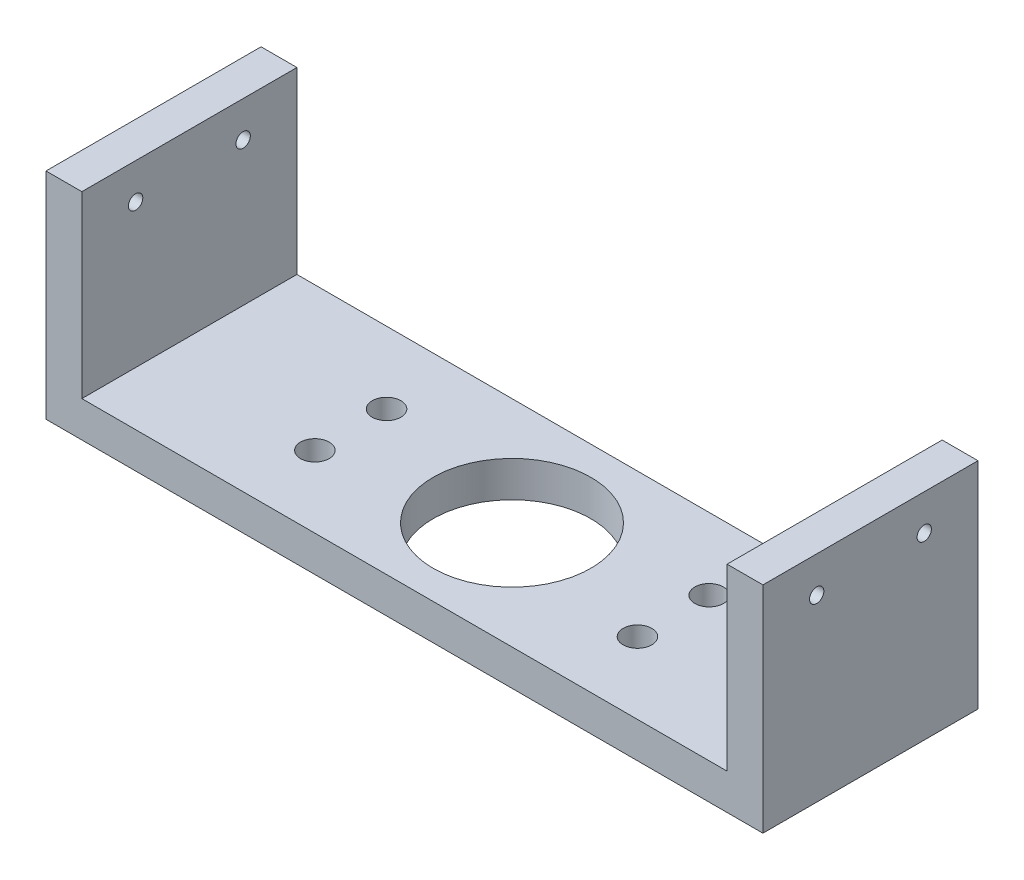
ISO-10303-21;
HEADER;
FILE_DESCRIPTION(('STEP AP214'),'2;1');
FILE_NAME('part.step','',(''),(''),'','','');
FILE_SCHEMA(('AUTOMOTIVE_DESIGN { 1 0 10303 214 1 1 1 1 }'));
ENDSEC;
DATA;
#1=APPLICATION_CONTEXT('core data for automotive mechanical design processes');
#2=APPLICATION_PROTOCOL_DEFINITION('international standard','automotive_design',2000,#1);
#3=PRODUCT_CONTEXT('',#1,'mechanical');
#4=PRODUCT('Part','Part','',(#3));
#5=PRODUCT_RELATED_PRODUCT_CATEGORY('part','',(#4));
#6=PRODUCT_DEFINITION_FORMATION('','',#4);
#7=PRODUCT_DEFINITION_CONTEXT('part definition',#1,'design');
#8=PRODUCT_DEFINITION('design','',#6,#7);
#9=PRODUCT_DEFINITION_SHAPE('','',#8);
#10=(LENGTH_UNIT() NAMED_UNIT(*) SI_UNIT(.MILLI.,.METRE.));
#11=(NAMED_UNIT(*) PLANE_ANGLE_UNIT() SI_UNIT($,.RADIAN.));
#12=(NAMED_UNIT(*) SI_UNIT($,.STERADIAN.) SOLID_ANGLE_UNIT());
#13=UNCERTAINTY_MEASURE_WITH_UNIT(LENGTH_MEASURE(1.E-05),#10,'distance_accuracy_value','');
#14=(GEOMETRIC_REPRESENTATION_CONTEXT(3) GLOBAL_UNCERTAINTY_ASSIGNED_CONTEXT((#13)) GLOBAL_UNIT_ASSIGNED_CONTEXT((#10,
#11,#12)) REPRESENTATION_CONTEXT('',''));
#15=CARTESIAN_POINT('',(0.,0.,0.));
#16=DIRECTION('',(0.,0.,1.));
#17=DIRECTION('',(1.,0.,0.));
#18=AXIS2_PLACEMENT_3D('',#15,#16,#17);
#19=CARTESIAN_POINT('',(0.,5.,0.));
#20=DIRECTION('',(0.,1.,0.));
#21=DIRECTION('',(0.,0.,1.));
#22=AXIS2_PLACEMENT_3D('',#19,#20,#21);
#23=PLANE('',#22);
#24=CARTESIAN_POINT('',(22.5,5.,-4.99999999999999));
#25=DIRECTION('',(0.,1.,0.));
#26=DIRECTION('',(0.,0.,1.));
#27=AXIS2_PLACEMENT_3D('',#24,#25,#26);
#28=CIRCLE('',#27,2.);
#29=CARTESIAN_POINT('',(22.5,5.,-2.99999999999999));
#30=VERTEX_POINT('',#29);
#31=EDGE_CURVE('E188',#30,#30,#28,.T.);
#32=ORIENTED_EDGE('',*,*,#31,.F.);
#33=EDGE_LOOP('',(#32));
#34=FACE_BOUND('',#33,.T.);
#35=CARTESIAN_POINT('',(-22.5,5.,5.));
#36=DIRECTION('',(0.,1.,0.));
#37=DIRECTION('',(0.,0.,1.));
#38=AXIS2_PLACEMENT_3D('',#35,#36,#37);
#39=CIRCLE('',#38,2.);
#40=CARTESIAN_POINT('',(-22.5,5.,7.));
#41=VERTEX_POINT('',#40);
#42=EDGE_CURVE('E328',#41,#41,#39,.T.);
#43=ORIENTED_EDGE('',*,*,#42,.F.);
#44=EDGE_LOOP('',(#43));
#45=FACE_BOUND('',#44,.T.);
#46=CARTESIAN_POINT('',(22.5,5.,5.00000000000001));
#47=DIRECTION('',(0.,1.,0.));
#48=DIRECTION('',(0.,0.,1.));
#49=AXIS2_PLACEMENT_3D('',#46,#47,#48);
#50=CIRCLE('',#49,2.);
#51=CARTESIAN_POINT('',(22.5,5.,7.00000000000001));
#52=VERTEX_POINT('',#51);
#53=EDGE_CURVE('E309',#52,#52,#50,.T.);
#54=ORIENTED_EDGE('',*,*,#53,.F.);
#55=EDGE_LOOP('',(#54));
#56=FACE_BOUND('',#55,.T.);
#57=CARTESIAN_POINT('',(-22.5,5.,-4.99999999999999));
#58=DIRECTION('',(0.,1.,0.));
#59=DIRECTION('',(0.,0.,1.));
#60=AXIS2_PLACEMENT_3D('',#57,#58,#59);
#61=CIRCLE('',#60,2.);
#62=CARTESIAN_POINT('',(-22.5,5.,-2.99999999999999));
#63=VERTEX_POINT('',#62);
#64=EDGE_CURVE('E325',#63,#63,#61,.T.);
#65=ORIENTED_EDGE('',*,*,#64,.F.);
#66=EDGE_LOOP('',(#65));
#67=FACE_BOUND('',#66,.T.);
#68=CARTESIAN_POINT('',(0.,5.,0.));
#69=DIRECTION('',(0.,1.,0.));
#70=DIRECTION('',(0.,0.,1.));
#71=AXIS2_PLACEMENT_3D('',#68,#69,#70);
#72=CIRCLE('',#71,11.);
#73=CARTESIAN_POINT('',(0.,5.,11.));
#74=VERTEX_POINT('',#73);
#75=EDGE_CURVE('E154',#74,#74,#72,.T.);
#76=ORIENTED_EDGE('',*,*,#75,.F.);
#77=EDGE_LOOP('',(#76));
#78=FACE_BOUND('',#77,.T.);
#79=DIRECTION('',(1.,0.,0.));
#80=VECTOR('',#79,1.);
#81=CARTESIAN_POINT('',(-50.,5.,15.));
#82=LINE('',#81,#80);
#83=CARTESIAN_POINT('',(-45.,5.,15.));
#84=VERTEX_POINT('',#83);
#85=CARTESIAN_POINT('',(45.,5.,15.));
#86=VERTEX_POINT('',#85);
#87=EDGE_CURVE('E61',#84,#86,#82,.T.);
#88=ORIENTED_EDGE('',*,*,#87,.T.);
#89=DIRECTION('',(0.,0.,1.));
#90=VECTOR('',#89,1.);
#91=CARTESIAN_POINT('',(45.,5.,-15.));
#92=LINE('',#91,#90);
#93=CARTESIAN_POINT('',(45.,5.,-15.));
#94=VERTEX_POINT('',#93);
#95=EDGE_CURVE('E56',#94,#86,#92,.T.);
#96=ORIENTED_EDGE('',*,*,#95,.F.);
#97=DIRECTION('',(-1.,0.,0.));
#98=VECTOR('',#97,1.);
#99=CARTESIAN_POINT('',(-50.,5.,-15.));
#100=LINE('',#99,#98);
#101=CARTESIAN_POINT('',(-45.,5.,-15.));
#102=VERTEX_POINT('',#101);
#103=EDGE_CURVE('E160',#94,#102,#100,.T.);
#104=ORIENTED_EDGE('',*,*,#103,.T.);
#105=DIRECTION('',(0.,0.,-1.));
#106=VECTOR('',#105,1.);
#107=CARTESIAN_POINT('',(-45.,5.,-15.));
#108=LINE('',#107,#106);
#109=EDGE_CURVE('E130',#84,#102,#108,.T.);
#110=ORIENTED_EDGE('',*,*,#109,.F.);
#111=EDGE_LOOP('',(#88,#96,#104,#110));
#112=FACE_BOUND('',#111,.T.);
#113=ADVANCED_FACE('F39',(#34,#45,#56,#67,#78,#112),#23,.T.);
#114=CARTESIAN_POINT('',(0.,0.,0.));
#115=DIRECTION('',(0.,1.,0.));
#116=DIRECTION('',(0.,0.,1.));
#117=AXIS2_PLACEMENT_3D('',#114,#115,#116);
#118=PLANE('',#117);
#119=CARTESIAN_POINT('',(22.5,0.,-4.99999999999999));
#120=DIRECTION('',(0.,-1.,0.));
#121=DIRECTION('',(0.,0.,-1.));
#122=AXIS2_PLACEMENT_3D('',#119,#120,#121);
#123=CIRCLE('',#122,2.);
#124=CARTESIAN_POINT('',(22.5,0.,-6.99999999999999));
#125=VERTEX_POINT('',#124);
#126=EDGE_CURVE('E317',#125,#125,#123,.T.);
#127=ORIENTED_EDGE('',*,*,#126,.F.);
#128=EDGE_LOOP('',(#127));
#129=FACE_BOUND('',#128,.T.);
#130=CARTESIAN_POINT('',(-22.5,0.,5.));
#131=DIRECTION('',(0.,-1.,0.));
#132=DIRECTION('',(0.,0.,-1.));
#133=AXIS2_PLACEMENT_3D('',#130,#131,#132);
#134=CIRCLE('',#133,2.);
#135=CARTESIAN_POINT('',(-22.5,0.,3.));
#136=VERTEX_POINT('',#135);
#137=EDGE_CURVE('E314',#136,#136,#134,.T.);
#138=ORIENTED_EDGE('',*,*,#137,.F.);
#139=EDGE_LOOP('',(#138));
#140=FACE_BOUND('',#139,.T.);
#141=CARTESIAN_POINT('',(22.5,0.,5.00000000000001));
#142=DIRECTION('',(0.,-1.,0.));
#143=DIRECTION('',(0.,0.,-1.));
#144=AXIS2_PLACEMENT_3D('',#141,#142,#143);
#145=CIRCLE('',#144,2.);
#146=CARTESIAN_POINT('',(22.5,0.,3.));
#147=VERTEX_POINT('',#146);
#148=EDGE_CURVE('E312',#147,#147,#145,.T.);
#149=ORIENTED_EDGE('',*,*,#148,.F.);
#150=EDGE_LOOP('',(#149));
#151=FACE_BOUND('',#150,.T.);
#152=CARTESIAN_POINT('',(-22.5,0.,-4.99999999999999));
#153=DIRECTION('',(0.,-1.,0.));
#154=DIRECTION('',(0.,0.,-1.));
#155=AXIS2_PLACEMENT_3D('',#152,#153,#154);
#156=CIRCLE('',#155,2.);
#157=CARTESIAN_POINT('',(-22.5,0.,-7.));
#158=VERTEX_POINT('',#157);
#159=EDGE_CURVE('E321',#158,#158,#156,.T.);
#160=ORIENTED_EDGE('',*,*,#159,.F.);
#161=EDGE_LOOP('',(#160));
#162=FACE_BOUND('',#161,.T.);
#163=DIRECTION('',(0.,0.,-1.));
#164=VECTOR('',#163,1.);
#165=CARTESIAN_POINT('',(50.,0.,-15.));
#166=LINE('',#165,#164);
#167=CARTESIAN_POINT('',(50.,0.,15.));
#168=VERTEX_POINT('',#167);
#169=CARTESIAN_POINT('',(50.,0.,-15.));
#170=VERTEX_POINT('',#169);
#171=EDGE_CURVE('E157',#168,#170,#166,.T.);
#172=ORIENTED_EDGE('',*,*,#171,.F.);
#173=DIRECTION('',(1.,0.,0.));
#174=VECTOR('',#173,1.);
#175=CARTESIAN_POINT('',(-50.,0.,15.));
#176=LINE('',#175,#174);
#177=CARTESIAN_POINT('',(-50.,0.,15.));
#178=VERTEX_POINT('',#177);
#179=EDGE_CURVE('E111',#178,#168,#176,.T.);
#180=ORIENTED_EDGE('',*,*,#179,.F.);
#181=DIRECTION('',(0.,0.,1.));
#182=VECTOR('',#181,1.);
#183=CARTESIAN_POINT('',(-50.,0.,-15.));
#184=LINE('',#183,#182);
#185=CARTESIAN_POINT('',(-50.,0.,-15.));
#186=VERTEX_POINT('',#185);
#187=EDGE_CURVE('E166',#186,#178,#184,.T.);
#188=ORIENTED_EDGE('',*,*,#187,.F.);
#189=DIRECTION('',(-1.,0.,0.));
#190=VECTOR('',#189,1.);
#191=CARTESIAN_POINT('',(-50.,0.,-15.));
#192=LINE('',#191,#190);
#193=EDGE_CURVE('E164',#170,#186,#192,.T.);
#194=ORIENTED_EDGE('',*,*,#193,.F.);
#195=EDGE_LOOP('',(#172,#180,#188,#194));
#196=FACE_BOUND('',#195,.T.);
#197=CARTESIAN_POINT('',(0.,0.,0.));
#198=DIRECTION('',(0.,1.,0.));
#199=DIRECTION('',(0.,0.,1.));
#200=AXIS2_PLACEMENT_3D('',#197,#198,#199);
#201=CIRCLE('',#200,11.);
#202=CARTESIAN_POINT('',(0.,0.,11.));
#203=VERTEX_POINT('',#202);
#204=EDGE_CURVE('E153',#203,#203,#201,.T.);
#205=ORIENTED_EDGE('',*,*,#204,.T.);
#206=EDGE_LOOP('',(#205));
#207=FACE_BOUND('',#206,.T.);
#208=ADVANCED_FACE('F221',(#129,#140,#151,#162,#196,#207),#118,.F.);
#209=CARTESIAN_POINT('',(50.,5.,-15.));
#210=DIRECTION('',(-1.,0.,0.));
#211=DIRECTION('',(0.,0.,1.));
#212=AXIS2_PLACEMENT_3D('',#209,#210,#211);
#213=PLANE('',#212);
#214=CARTESIAN_POINT('',(50.,25.,7.5));
#215=DIRECTION('',(1.,0.,0.));
#216=DIRECTION('',(0.,0.,-1.));
#217=AXIS2_PLACEMENT_3D('',#214,#215,#216);
#218=CIRCLE('',#217,1.);
#219=CARTESIAN_POINT('',(50.,25.,6.5));
#220=VERTEX_POINT('',#219);
#221=EDGE_CURVE('E180',#220,#220,#218,.T.);
#222=ORIENTED_EDGE('',*,*,#221,.F.);
#223=EDGE_LOOP('',(#222));
#224=FACE_BOUND('',#223,.T.);
#225=CARTESIAN_POINT('',(50.,25.,-7.5));
#226=DIRECTION('',(1.,0.,0.));
#227=DIRECTION('',(0.,0.,-1.));
#228=AXIS2_PLACEMENT_3D('',#225,#226,#227);
#229=CIRCLE('',#228,1.);
#230=CARTESIAN_POINT('',(50.,25.,-8.5));
#231=VERTEX_POINT('',#230);
#232=EDGE_CURVE('E185',#231,#231,#229,.T.);
#233=ORIENTED_EDGE('',*,*,#232,.F.);
#234=EDGE_LOOP('',(#233));
#235=FACE_BOUND('',#234,.T.);
#236=ORIENTED_EDGE('',*,*,#171,.T.);
#237=DIRECTION('',(0.,-1.,0.));
#238=VECTOR('',#237,1.);
#239=CARTESIAN_POINT('',(50.,5.,-15.));
#240=LINE('',#239,#238);
#241=CARTESIAN_POINT('',(50.,30.,-15.));
#242=VERTEX_POINT('',#241);
#243=EDGE_CURVE('E11',#242,#170,#240,.T.);
#244=ORIENTED_EDGE('',*,*,#243,.F.);
#245=DIRECTION('',(0.,0.,-1.));
#246=VECTOR('',#245,1.);
#247=CARTESIAN_POINT('',(50.,30.,-15.));
#248=LINE('',#247,#246);
#249=CARTESIAN_POINT('',(50.,30.,15.));
#250=VERTEX_POINT('',#249);
#251=EDGE_CURVE('E121',#250,#242,#248,.T.);
#252=ORIENTED_EDGE('',*,*,#251,.F.);
#253=DIRECTION('',(0.,-1.,0.));
#254=VECTOR('',#253,1.);
#255=CARTESIAN_POINT('',(50.,5.,15.));
#256=LINE('',#255,#254);
#257=EDGE_CURVE('E104',#250,#168,#256,.T.);
#258=ORIENTED_EDGE('',*,*,#257,.T.);
#259=EDGE_LOOP('',(#236,#244,#252,#258));
#260=FACE_BOUND('',#259,.T.);
#261=ADVANCED_FACE('F41',(#224,#235,#260),#213,.F.);
#262=CARTESIAN_POINT('',(-50.,5.,-15.));
#263=DIRECTION('',(0.,0.,1.));
#264=DIRECTION('',(1.,0.,0.));
#265=AXIS2_PLACEMENT_3D('',#262,#263,#264);
#266=PLANE('',#265);
#267=ORIENTED_EDGE('',*,*,#193,.T.);
#268=DIRECTION('',(0.,-1.,0.));
#269=VECTOR('',#268,1.);
#270=CARTESIAN_POINT('',(-50.,5.,-15.));
#271=LINE('',#270,#269);
#272=CARTESIAN_POINT('',(-50.,30.,-15.));
#273=VERTEX_POINT('',#272);
#274=EDGE_CURVE('E48',#273,#186,#271,.T.);
#275=ORIENTED_EDGE('',*,*,#274,.F.);
#276=DIRECTION('',(-1.,0.,0.));
#277=VECTOR('',#276,1.);
#278=CARTESIAN_POINT('',(-50.,30.,-15.));
#279=LINE('',#278,#277);
#280=CARTESIAN_POINT('',(-45.,30.,-15.));
#281=VERTEX_POINT('',#280);
#282=EDGE_CURVE('E142',#281,#273,#279,.T.);
#283=ORIENTED_EDGE('',*,*,#282,.F.);
#284=DIRECTION('',(0.,-1.,0.));
#285=VECTOR('',#284,1.);
#286=CARTESIAN_POINT('',(-45.,30.,-15.));
#287=LINE('',#286,#285);
#288=EDGE_CURVE('E145',#281,#102,#287,.T.);
#289=ORIENTED_EDGE('',*,*,#288,.T.);
#290=ORIENTED_EDGE('',*,*,#103,.F.);
#291=DIRECTION('',(0.,-1.,0.));
#292=VECTOR('',#291,1.);
#293=CARTESIAN_POINT('',(45.,30.,-15.));
#294=LINE('',#293,#292);
#295=CARTESIAN_POINT('',(45.,30.,-15.));
#296=VERTEX_POINT('',#295);
#297=EDGE_CURVE('E199',#296,#94,#294,.T.);
#298=ORIENTED_EDGE('',*,*,#297,.F.);
#299=DIRECTION('',(-1.,0.,0.));
#300=VECTOR('',#299,1.);
#301=CARTESIAN_POINT('',(50.,30.,-15.));
#302=LINE('',#301,#300);
#303=EDGE_CURVE('E128',#242,#296,#302,.T.);
#304=ORIENTED_EDGE('',*,*,#303,.F.);
#305=ORIENTED_EDGE('',*,*,#243,.T.);
#306=EDGE_LOOP('',(#267,#275,#283,#289,#290,#298,#304,#305));
#307=FACE_BOUND('',#306,.T.);
#308=ADVANCED_FACE('F207',(#307),#266,.F.);
#309=CARTESIAN_POINT('',(-50.,5.,-15.));
#310=DIRECTION('',(1.,0.,0.));
#311=DIRECTION('',(0.,0.,-1.));
#312=AXIS2_PLACEMENT_3D('',#309,#310,#311);
#313=PLANE('',#312);
#314=CARTESIAN_POINT('',(-50.,25.,7.5));
#315=DIRECTION('',(1.,0.,0.));
#316=DIRECTION('',(0.,0.,-1.));
#317=AXIS2_PLACEMENT_3D('',#314,#315,#316);
#318=CIRCLE('',#317,1.);
#319=CARTESIAN_POINT('',(-50.,25.,6.5));
#320=VERTEX_POINT('',#319);
#321=EDGE_CURVE('E174',#320,#320,#318,.T.);
#322=ORIENTED_EDGE('',*,*,#321,.T.);
#323=EDGE_LOOP('',(#322));
#324=FACE_BOUND('',#323,.T.);
#325=CARTESIAN_POINT('',(-50.,25.,-7.5));
#326=DIRECTION('',(1.,0.,0.));
#327=DIRECTION('',(0.,0.,-1.));
#328=AXIS2_PLACEMENT_3D('',#325,#326,#327);
#329=CIRCLE('',#328,1.);
#330=CARTESIAN_POINT('',(-50.,25.,-8.5));
#331=VERTEX_POINT('',#330);
#332=EDGE_CURVE('E193',#331,#331,#329,.T.);
#333=ORIENTED_EDGE('',*,*,#332,.T.);
#334=EDGE_LOOP('',(#333));
#335=FACE_BOUND('',#334,.T.);
#336=ORIENTED_EDGE('',*,*,#187,.T.);
#337=DIRECTION('',(0.,-1.,0.));
#338=VECTOR('',#337,1.);
#339=CARTESIAN_POINT('',(-50.,5.,15.));
#340=LINE('',#339,#338);
#341=CARTESIAN_POINT('',(-50.,30.,15.));
#342=VERTEX_POINT('',#341);
#343=EDGE_CURVE('E116',#342,#178,#340,.T.);
#344=ORIENTED_EDGE('',*,*,#343,.F.);
#345=DIRECTION('',(0.,0.,1.));
#346=VECTOR('',#345,1.);
#347=CARTESIAN_POINT('',(-50.,30.,-15.));
#348=LINE('',#347,#346);
#349=EDGE_CURVE('E135',#273,#342,#348,.T.);
#350=ORIENTED_EDGE('',*,*,#349,.F.);
#351=ORIENTED_EDGE('',*,*,#274,.T.);
#352=EDGE_LOOP('',(#336,#344,#350,#351));
#353=FACE_BOUND('',#352,.T.);
#354=ADVANCED_FACE('F218',(#324,#335,#353),#313,.F.);
#355=CARTESIAN_POINT('',(-50.,5.,15.));
#356=DIRECTION('',(0.,0.,-1.));
#357=DIRECTION('',(-1.,0.,0.));
#358=AXIS2_PLACEMENT_3D('',#355,#356,#357);
#359=PLANE('',#358);
#360=ORIENTED_EDGE('',*,*,#179,.T.);
#361=ORIENTED_EDGE('',*,*,#257,.F.);
#362=DIRECTION('',(1.,0.,0.));
#363=VECTOR('',#362,1.);
#364=CARTESIAN_POINT('',(50.,30.,15.));
#365=LINE('',#364,#363);
#366=CARTESIAN_POINT('',(45.,30.,15.));
#367=VERTEX_POINT('',#366);
#368=EDGE_CURVE('E108',#367,#250,#365,.T.);
#369=ORIENTED_EDGE('',*,*,#368,.F.);
#370=DIRECTION('',(0.,-1.,0.));
#371=VECTOR('',#370,1.);
#372=CARTESIAN_POINT('',(45.,30.,15.));
#373=LINE('',#372,#371);
#374=EDGE_CURVE('E125',#367,#86,#373,.T.);
#375=ORIENTED_EDGE('',*,*,#374,.T.);
#376=ORIENTED_EDGE('',*,*,#87,.F.);
#377=DIRECTION('',(0.,-1.,0.));
#378=VECTOR('',#377,1.);
#379=CARTESIAN_POINT('',(-45.,30.,15.));
#380=LINE('',#379,#378);
#381=CARTESIAN_POINT('',(-45.,30.,15.));
#382=VERTEX_POINT('',#381);
#383=EDGE_CURVE('E150',#382,#84,#380,.T.);
#384=ORIENTED_EDGE('',*,*,#383,.F.);
#385=DIRECTION('',(1.,0.,0.));
#386=VECTOR('',#385,1.);
#387=CARTESIAN_POINT('',(-50.,30.,15.));
#388=LINE('',#387,#386);
#389=EDGE_CURVE('E138',#342,#382,#388,.T.);
#390=ORIENTED_EDGE('',*,*,#389,.F.);
#391=ORIENTED_EDGE('',*,*,#343,.T.);
#392=EDGE_LOOP('',(#360,#361,#369,#375,#376,#384,#390,#391));
#393=FACE_BOUND('',#392,.T.);
#394=ADVANCED_FACE('F106',(#393),#359,.F.);
#395=CARTESIAN_POINT('',(0.,5.,0.));
#396=DIRECTION('',(0.,-1.,0.));
#397=DIRECTION('',(0.,0.,-1.));
#398=AXIS2_PLACEMENT_3D('',#395,#396,#397);
#399=CYLINDRICAL_SURFACE('',#398,11.);
#400=ORIENTED_EDGE('',*,*,#75,.T.);
#401=EDGE_LOOP('',(#400));
#402=FACE_BOUND('',#401,.T.);
#403=ORIENTED_EDGE('',*,*,#204,.F.);
#404=EDGE_LOOP('',(#403));
#405=FACE_BOUND('',#404,.T.);
#406=ADVANCED_FACE('F228',(#402,#405),#399,.F.);
#407=CARTESIAN_POINT('',(-45.,30.,-15.));
#408=DIRECTION('',(-1.,0.,0.));
#409=DIRECTION('',(0.,0.,1.));
#410=AXIS2_PLACEMENT_3D('',#407,#408,#409);
#411=PLANE('',#410);
#412=CARTESIAN_POINT('',(-45.,25.,7.5));
#413=DIRECTION('',(-1.,0.,0.));
#414=DIRECTION('',(0.,0.,1.));
#415=AXIS2_PLACEMENT_3D('',#412,#413,#414);
#416=CIRCLE('',#415,1.);
#417=CARTESIAN_POINT('',(-45.,25.,8.5));
#418=VERTEX_POINT('',#417);
#419=EDGE_CURVE('E196',#418,#418,#416,.T.);
#420=ORIENTED_EDGE('',*,*,#419,.T.);
#421=EDGE_LOOP('',(#420));
#422=FACE_BOUND('',#421,.T.);
#423=CARTESIAN_POINT('',(-45.,25.,-7.5));
#424=DIRECTION('',(-1.,0.,0.));
#425=DIRECTION('',(0.,0.,1.));
#426=AXIS2_PLACEMENT_3D('',#423,#424,#425);
#427=CIRCLE('',#426,1.);
#428=CARTESIAN_POINT('',(-45.,25.,-6.5));
#429=VERTEX_POINT('',#428);
#430=EDGE_CURVE('E173',#429,#429,#427,.T.);
#431=ORIENTED_EDGE('',*,*,#430,.T.);
#432=EDGE_LOOP('',(#431));
#433=FACE_BOUND('',#432,.T.);
#434=ORIENTED_EDGE('',*,*,#109,.T.);
#435=ORIENTED_EDGE('',*,*,#288,.F.);
#436=DIRECTION('',(0.,0.,-1.));
#437=VECTOR('',#436,1.);
#438=CARTESIAN_POINT('',(-45.,30.,-15.));
#439=LINE('',#438,#437);
#440=EDGE_CURVE('E140',#382,#281,#439,.T.);
#441=ORIENTED_EDGE('',*,*,#440,.F.);
#442=ORIENTED_EDGE('',*,*,#383,.T.);
#443=EDGE_LOOP('',(#434,#435,#441,#442));
#444=FACE_BOUND('',#443,.T.);
#445=ADVANCED_FACE('F211',(#422,#433,#444),#411,.F.);
#446=CARTESIAN_POINT('',(0.,30.,0.));
#447=DIRECTION('',(0.,1.,0.));
#448=DIRECTION('',(0.,0.,1.));
#449=AXIS2_PLACEMENT_3D('',#446,#447,#448);
#450=PLANE('',#449);
#451=ORIENTED_EDGE('',*,*,#349,.T.);
#452=ORIENTED_EDGE('',*,*,#389,.T.);
#453=ORIENTED_EDGE('',*,*,#440,.T.);
#454=ORIENTED_EDGE('',*,*,#282,.T.);
#455=EDGE_LOOP('',(#451,#452,#453,#454));
#456=FACE_BOUND('',#455,.T.);
#457=ADVANCED_FACE('F216',(#456),#450,.T.);
#458=CARTESIAN_POINT('',(45.,30.,-15.));
#459=DIRECTION('',(1.,0.,0.));
#460=DIRECTION('',(0.,0.,-1.));
#461=AXIS2_PLACEMENT_3D('',#458,#459,#460);
#462=PLANE('',#461);
#463=CARTESIAN_POINT('',(45.,25.,7.5));
#464=DIRECTION('',(1.,0.,0.));
#465=DIRECTION('',(0.,0.,-1.));
#466=AXIS2_PLACEMENT_3D('',#463,#464,#465);
#467=CIRCLE('',#466,1.);
#468=CARTESIAN_POINT('',(45.,25.,6.5));
#469=VERTEX_POINT('',#468);
#470=EDGE_CURVE('E43',#469,#469,#467,.T.);
#471=ORIENTED_EDGE('',*,*,#470,.T.);
#472=EDGE_LOOP('',(#471));
#473=FACE_BOUND('',#472,.T.);
#474=CARTESIAN_POINT('',(45.,25.,-7.5));
#475=DIRECTION('',(1.,0.,0.));
#476=DIRECTION('',(0.,0.,-1.));
#477=AXIS2_PLACEMENT_3D('',#474,#475,#476);
#478=CIRCLE('',#477,1.);
#479=CARTESIAN_POINT('',(45.,25.,-8.5));
#480=VERTEX_POINT('',#479);
#481=EDGE_CURVE('E171',#480,#480,#478,.T.);
#482=ORIENTED_EDGE('',*,*,#481,.T.);
#483=EDGE_LOOP('',(#482));
#484=FACE_BOUND('',#483,.T.);
#485=ORIENTED_EDGE('',*,*,#95,.T.);
#486=ORIENTED_EDGE('',*,*,#374,.F.);
#487=DIRECTION('',(0.,0.,1.));
#488=VECTOR('',#487,1.);
#489=CARTESIAN_POINT('',(45.,30.,-15.));
#490=LINE('',#489,#488);
#491=EDGE_CURVE('E123',#296,#367,#490,.T.);
#492=ORIENTED_EDGE('',*,*,#491,.F.);
#493=ORIENTED_EDGE('',*,*,#297,.T.);
#494=EDGE_LOOP('',(#485,#486,#492,#493));
#495=FACE_BOUND('',#494,.T.);
#496=ADVANCED_FACE('F204',(#473,#484,#495),#462,.F.);
#497=CARTESIAN_POINT('',(0.,30.,0.));
#498=DIRECTION('',(0.,-1.,0.));
#499=DIRECTION('',(0.,0.,-1.));
#500=AXIS2_PLACEMENT_3D('',#497,#498,#499);
#501=PLANE('',#500);
#502=ORIENTED_EDGE('',*,*,#251,.T.);
#503=ORIENTED_EDGE('',*,*,#303,.T.);
#504=ORIENTED_EDGE('',*,*,#491,.T.);
#505=ORIENTED_EDGE('',*,*,#368,.T.);
#506=EDGE_LOOP('',(#502,#503,#504,#505));
#507=FACE_BOUND('',#506,.T.);
#508=ADVANCED_FACE('F120',(#507),#501,.F.);
#509=CARTESIAN_POINT('',(-50.,25.,-7.5));
#510=DIRECTION('',(1.,0.,0.));
#511=DIRECTION('',(0.,0.,-1.));
#512=AXIS2_PLACEMENT_3D('',#509,#510,#511);
#513=CYLINDRICAL_SURFACE('',#512,1.);
#514=ORIENTED_EDGE('',*,*,#232,.T.);
#515=EDGE_LOOP('',(#514));
#516=FACE_BOUND('',#515,.T.);
#517=ORIENTED_EDGE('',*,*,#481,.F.);
#518=EDGE_LOOP('',(#517));
#519=FACE_BOUND('',#518,.T.);
#520=ADVANCED_FACE('F259',(#516,#519),#513,.F.);
#521=CARTESIAN_POINT('',(-50.,25.,7.5));
#522=DIRECTION('',(1.,0.,0.));
#523=DIRECTION('',(0.,0.,-1.));
#524=AXIS2_PLACEMENT_3D('',#521,#522,#523);
#525=CYLINDRICAL_SURFACE('',#524,1.);
#526=ORIENTED_EDGE('',*,*,#221,.T.);
#527=EDGE_LOOP('',(#526));
#528=FACE_BOUND('',#527,.T.);
#529=ORIENTED_EDGE('',*,*,#470,.F.);
#530=EDGE_LOOP('',(#529));
#531=FACE_BOUND('',#530,.T.);
#532=ADVANCED_FACE('F262',(#528,#531),#525,.F.);
#533=ORIENTED_EDGE('',*,*,#332,.F.);
#534=EDGE_LOOP('',(#533));
#535=FACE_BOUND('',#534,.T.);
#536=ORIENTED_EDGE('',*,*,#430,.F.);
#537=EDGE_LOOP('',(#536));
#538=FACE_BOUND('',#537,.T.);
#539=ADVANCED_FACE('F264',(#535,#538),#513,.F.);
#540=ORIENTED_EDGE('',*,*,#321,.F.);
#541=EDGE_LOOP('',(#540));
#542=FACE_BOUND('',#541,.T.);
#543=ORIENTED_EDGE('',*,*,#419,.F.);
#544=EDGE_LOOP('',(#543));
#545=FACE_BOUND('',#544,.T.);
#546=ADVANCED_FACE('F271',(#542,#545),#525,.F.);
#547=CARTESIAN_POINT('',(-22.5,10.,-4.99999999999999));
#548=DIRECTION('',(0.,-1.,0.));
#549=DIRECTION('',(0.,0.,-1.));
#550=AXIS2_PLACEMENT_3D('',#547,#548,#549);
#551=CYLINDRICAL_SURFACE('',#550,2.);
#552=ORIENTED_EDGE('',*,*,#64,.T.);
#553=EDGE_LOOP('',(#552));
#554=FACE_BOUND('',#553,.T.);
#555=ORIENTED_EDGE('',*,*,#159,.T.);
#556=EDGE_LOOP('',(#555));
#557=FACE_BOUND('',#556,.T.);
#558=ADVANCED_FACE('F279',(#554,#557),#551,.F.);
#559=CARTESIAN_POINT('',(22.5,10.,5.00000000000001));
#560=DIRECTION('',(0.,-1.,0.));
#561=DIRECTION('',(0.,0.,-1.));
#562=AXIS2_PLACEMENT_3D('',#559,#560,#561);
#563=CYLINDRICAL_SURFACE('',#562,2.);
#564=ORIENTED_EDGE('',*,*,#53,.T.);
#565=EDGE_LOOP('',(#564));
#566=FACE_BOUND('',#565,.T.);
#567=ORIENTED_EDGE('',*,*,#148,.T.);
#568=EDGE_LOOP('',(#567));
#569=FACE_BOUND('',#568,.T.);
#570=ADVANCED_FACE('F289',(#566,#569),#563,.F.);
#571=CARTESIAN_POINT('',(-22.5,10.,5.));
#572=DIRECTION('',(0.,-1.,0.));
#573=DIRECTION('',(0.,0.,-1.));
#574=AXIS2_PLACEMENT_3D('',#571,#572,#573);
#575=CYLINDRICAL_SURFACE('',#574,2.);
#576=ORIENTED_EDGE('',*,*,#42,.T.);
#577=EDGE_LOOP('',(#576));
#578=FACE_BOUND('',#577,.T.);
#579=ORIENTED_EDGE('',*,*,#137,.T.);
#580=EDGE_LOOP('',(#579));
#581=FACE_BOUND('',#580,.T.);
#582=ADVANCED_FACE('F294',(#578,#581),#575,.F.);
#583=CARTESIAN_POINT('',(22.5,10.,-4.99999999999999));
#584=DIRECTION('',(0.,-1.,0.));
#585=DIRECTION('',(0.,0.,-1.));
#586=AXIS2_PLACEMENT_3D('',#583,#584,#585);
#587=CYLINDRICAL_SURFACE('',#586,2.);
#588=ORIENTED_EDGE('',*,*,#31,.T.);
#589=EDGE_LOOP('',(#588));
#590=FACE_BOUND('',#589,.T.);
#591=ORIENTED_EDGE('',*,*,#126,.T.);
#592=EDGE_LOOP('',(#591));
#593=FACE_BOUND('',#592,.T.);
#594=ADVANCED_FACE('F297',(#590,#593),#587,.F.);
#595=CLOSED_SHELL('',(#113,#208,#261,#308,#354,#394,#406,#445,#457,#496,#508,#520,#532,#539,
#546,#558,#570,#582,#594));
#596=MANIFOLD_SOLID_BREP('B2',#595);
#597=ADVANCED_BREP_SHAPE_REPRESENTATION('',(#18,#596),#14);
#598=SHAPE_DEFINITION_REPRESENTATION(#9,#597);
ENDSEC;
END-ISO-10303-21;
